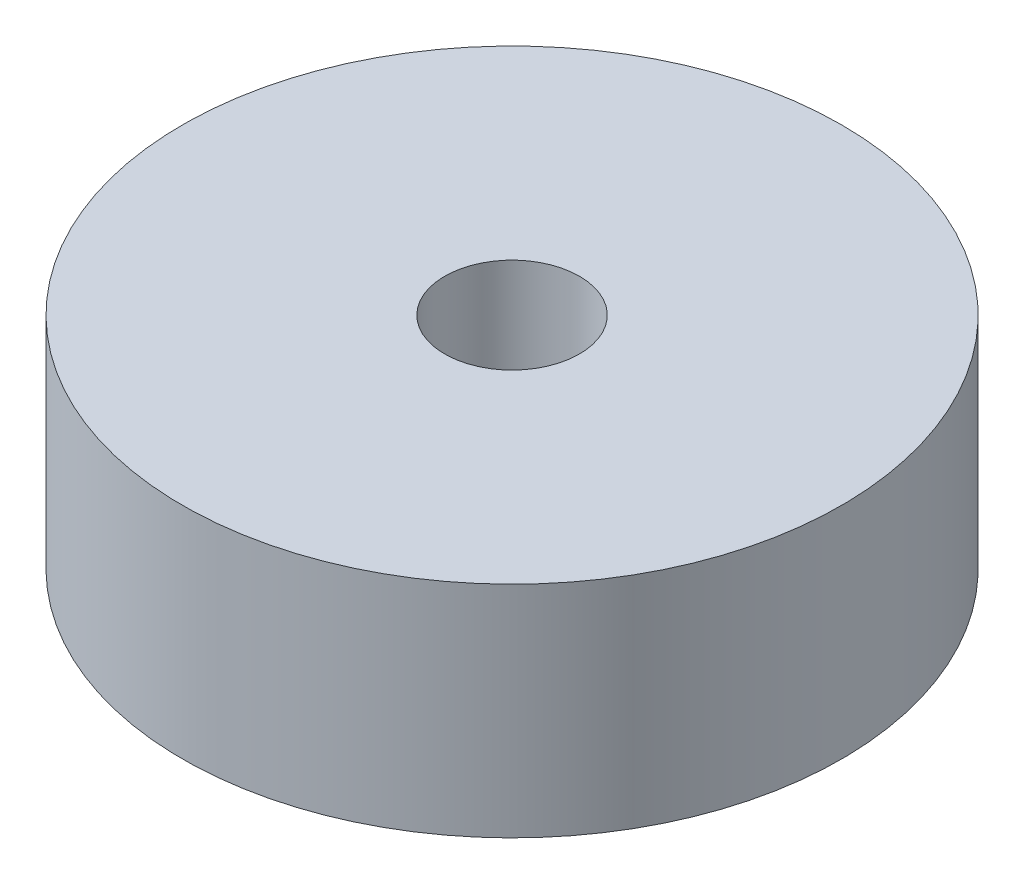
ISO-10303-21;
HEADER;
FILE_DESCRIPTION(('STEP AP214'),'2;1');
FILE_NAME('part.step','',(''),(''),'','','');
FILE_SCHEMA(('AUTOMOTIVE_DESIGN { 1 0 10303 214 1 1 1 1 }'));
ENDSEC;
DATA;
#1=APPLICATION_CONTEXT('core data for automotive mechanical design processes');
#2=APPLICATION_PROTOCOL_DEFINITION('international standard','automotive_design',2000,#1);
#3=PRODUCT_CONTEXT('',#1,'mechanical');
#4=PRODUCT('Part','Part','',(#3));
#5=PRODUCT_RELATED_PRODUCT_CATEGORY('part','',(#4));
#6=PRODUCT_DEFINITION_FORMATION('','',#4);
#7=PRODUCT_DEFINITION_CONTEXT('part definition',#1,'design');
#8=PRODUCT_DEFINITION('design','',#6,#7);
#9=PRODUCT_DEFINITION_SHAPE('','',#8);
#10=(LENGTH_UNIT() NAMED_UNIT(*) SI_UNIT(.MILLI.,.METRE.));
#11=(NAMED_UNIT(*) PLANE_ANGLE_UNIT() SI_UNIT($,.RADIAN.));
#12=(NAMED_UNIT(*) SI_UNIT($,.STERADIAN.) SOLID_ANGLE_UNIT());
#13=UNCERTAINTY_MEASURE_WITH_UNIT(LENGTH_MEASURE(1.E-05),#10,'distance_accuracy_value','');
#14=(GEOMETRIC_REPRESENTATION_CONTEXT(3) GLOBAL_UNCERTAINTY_ASSIGNED_CONTEXT((#13)) GLOBAL_UNIT_ASSIGNED_CONTEXT((#10,
#11,#12)) REPRESENTATION_CONTEXT('',''));
#15=CARTESIAN_POINT('',(0.,0.,0.));
#16=DIRECTION('',(0.,0.,1.));
#17=DIRECTION('',(1.,0.,0.));
#18=AXIS2_PLACEMENT_3D('',#15,#16,#17);
#19=CARTESIAN_POINT('',(0.,19.05,0.));
#20=DIRECTION('',(0.,1.,0.));
#21=DIRECTION('',(0.,0.,1.));
#22=AXIS2_PLACEMENT_3D('',#19,#20,#21);
#23=PLANE('',#22);
#24=CARTESIAN_POINT('',(0.,19.05,0.));
#25=DIRECTION('',(0.,1.,0.));
#26=DIRECTION('',(0.,0.,1.));
#27=AXIS2_PLACEMENT_3D('',#24,#25,#26);
#28=CIRCLE('',#27,28.575);
#29=CARTESIAN_POINT('',(0.,19.05,-28.575));
#30=VERTEX_POINT('',#29);
#31=EDGE_CURVE('E10',#30,#30,#28,.T.);
#32=ORIENTED_EDGE('',*,*,#31,.T.);
#33=EDGE_LOOP('',(#32));
#34=FACE_BOUND('',#33,.T.);
#35=CARTESIAN_POINT('',(0.,19.05,0.));
#36=DIRECTION('',(0.,1.,0.));
#37=DIRECTION('',(0.,0.,1.));
#38=AXIS2_PLACEMENT_3D('',#35,#36,#37);
#39=CIRCLE('',#38,5.842);
#40=CARTESIAN_POINT('',(0.,19.05,-5.842));
#41=VERTEX_POINT('',#40);
#42=EDGE_CURVE('E47',#41,#41,#39,.T.);
#43=ORIENTED_EDGE('',*,*,#42,.F.);
#44=EDGE_LOOP('',(#43));
#45=FACE_BOUND('',#44,.T.);
#46=ADVANCED_FACE('F36',(#34,#45),#23,.T.);
#47=CARTESIAN_POINT('',(0.,0.,0.));
#48=DIRECTION('',(0.,1.,0.));
#49=DIRECTION('',(0.,0.,1.));
#50=AXIS2_PLACEMENT_3D('',#47,#48,#49);
#51=PLANE('',#50);
#52=CARTESIAN_POINT('',(0.,0.,0.));
#53=DIRECTION('',(0.,1.,0.));
#54=DIRECTION('',(0.,0.,1.));
#55=AXIS2_PLACEMENT_3D('',#52,#53,#54);
#56=CIRCLE('',#55,28.575);
#57=CARTESIAN_POINT('',(0.,0.,-28.575));
#58=VERTEX_POINT('',#57);
#59=EDGE_CURVE('E40',#58,#58,#56,.T.);
#60=ORIENTED_EDGE('',*,*,#59,.F.);
#61=EDGE_LOOP('',(#60));
#62=FACE_BOUND('',#61,.T.);
#63=CARTESIAN_POINT('',(0.,0.,0.));
#64=DIRECTION('',(0.,1.,0.));
#65=DIRECTION('',(0.,0.,1.));
#66=AXIS2_PLACEMENT_3D('',#63,#64,#65);
#67=CIRCLE('',#66,5.842);
#68=CARTESIAN_POINT('',(0.,0.,-5.842));
#69=VERTEX_POINT('',#68);
#70=EDGE_CURVE('E49',#69,#69,#67,.T.);
#71=ORIENTED_EDGE('',*,*,#70,.T.);
#72=EDGE_LOOP('',(#71));
#73=FACE_BOUND('',#72,.T.);
#74=ADVANCED_FACE('F59',(#62,#73),#51,.F.);
#75=CARTESIAN_POINT('',(0.,19.05,0.));
#76=DIRECTION('',(0.,-1.,0.));
#77=DIRECTION('',(0.,0.,-1.));
#78=AXIS2_PLACEMENT_3D('',#75,#76,#77);
#79=CYLINDRICAL_SURFACE('',#78,28.575);
#80=CARTESIAN_POINT('',(0.,19.05,-28.575));
#81=CARTESIAN_POINT('',(0.,18.8515625,-28.575));
#82=CARTESIAN_POINT('',(0.,18.653125,-28.575));
#83=CARTESIAN_POINT('',(0.,18.25625,-28.575));
#84=CARTESIAN_POINT('',(0.,18.0578125,-28.575));
#85=CARTESIAN_POINT('',(0.,17.6609375,-28.575));
#86=CARTESIAN_POINT('',(0.,17.4625,-28.575));
#87=CARTESIAN_POINT('',(0.,17.065625,-28.575));
#88=CARTESIAN_POINT('',(0.,16.8671875,-28.575));
#89=CARTESIAN_POINT('',(0.,16.4703125,-28.575));
#90=CARTESIAN_POINT('',(0.,16.271875,-28.575));
#91=CARTESIAN_POINT('',(0.,15.875,-28.575));
#92=CARTESIAN_POINT('',(0.,15.6765625,-28.575));
#93=CARTESIAN_POINT('',(0.,15.2796875,-28.575));
#94=CARTESIAN_POINT('',(0.,15.08125,-28.575));
#95=CARTESIAN_POINT('',(0.,14.684375,-28.575));
#96=CARTESIAN_POINT('',(0.,14.4859375,-28.575));
#97=CARTESIAN_POINT('',(0.,14.0890625,-28.575));
#98=CARTESIAN_POINT('',(0.,13.890625,-28.575));
#99=CARTESIAN_POINT('',(0.,13.49375,-28.575));
#100=CARTESIAN_POINT('',(0.,13.2953125,-28.575));
#101=CARTESIAN_POINT('',(0.,12.8984375,-28.575));
#102=CARTESIAN_POINT('',(0.,12.7,-28.575));
#103=CARTESIAN_POINT('',(0.,12.303125,-28.575));
#104=CARTESIAN_POINT('',(0.,12.1046875,-28.575));
#105=CARTESIAN_POINT('',(0.,11.7078125,-28.575));
#106=CARTESIAN_POINT('',(0.,11.509375,-28.575));
#107=CARTESIAN_POINT('',(0.,11.1125,-28.575));
#108=CARTESIAN_POINT('',(0.,10.9140625,-28.575));
#109=CARTESIAN_POINT('',(0.,10.5171875,-28.575));
#110=CARTESIAN_POINT('',(0.,10.31875,-28.575));
#111=CARTESIAN_POINT('',(0.,9.921875,-28.575));
#112=CARTESIAN_POINT('',(0.,9.7234375,-28.575));
#113=CARTESIAN_POINT('',(0.,9.3265625,-28.575));
#114=CARTESIAN_POINT('',(0.,9.128125,-28.575));
#115=CARTESIAN_POINT('',(0.,8.73125,-28.575));
#116=CARTESIAN_POINT('',(0.,8.5328125,-28.575));
#117=CARTESIAN_POINT('',(0.,8.1359375,-28.575));
#118=CARTESIAN_POINT('',(0.,7.9375,-28.575));
#119=CARTESIAN_POINT('',(0.,7.540625,-28.575));
#120=CARTESIAN_POINT('',(0.,7.3421875,-28.575));
#121=CARTESIAN_POINT('',(0.,6.9453125,-28.575));
#122=CARTESIAN_POINT('',(0.,6.746875,-28.575));
#123=CARTESIAN_POINT('',(0.,6.35,-28.575));
#124=CARTESIAN_POINT('',(0.,6.1515625,-28.575));
#125=CARTESIAN_POINT('',(0.,5.7546875,-28.575));
#126=CARTESIAN_POINT('',(0.,5.55625,-28.575));
#127=CARTESIAN_POINT('',(0.,5.159375,-28.575));
#128=CARTESIAN_POINT('',(0.,4.9609375,-28.575));
#129=CARTESIAN_POINT('',(0.,4.5640625,-28.575));
#130=CARTESIAN_POINT('',(0.,4.365625,-28.575));
#131=CARTESIAN_POINT('',(0.,3.96875,-28.575));
#132=CARTESIAN_POINT('',(0.,3.7703125,-28.575));
#133=CARTESIAN_POINT('',(0.,3.3734375,-28.575));
#134=CARTESIAN_POINT('',(0.,3.175,-28.575));
#135=CARTESIAN_POINT('',(0.,2.778125,-28.575));
#136=CARTESIAN_POINT('',(0.,2.5796875,-28.575));
#137=CARTESIAN_POINT('',(0.,2.1828125,-28.575));
#138=CARTESIAN_POINT('',(0.,1.984375,-28.575));
#139=CARTESIAN_POINT('',(0.,1.5875,-28.575));
#140=CARTESIAN_POINT('',(0.,1.3890625,-28.575));
#141=CARTESIAN_POINT('',(0.,0.992187500000001,-28.575));
#142=CARTESIAN_POINT('',(0.,0.793750000000001,-28.575));
#143=CARTESIAN_POINT('',(0.,0.396875,-28.575));
#144=CARTESIAN_POINT('',(0.,0.1984375,-28.575));
#145=CARTESIAN_POINT('',(0.,0.,-28.575));
#146=B_SPLINE_CURVE_WITH_KNOTS('',3,(#80,#81,#82,#83,#84,#85,#86,#87,#88,#89,#90,#91,#92,#93,
#94,#95,#96,#97,#98,#99,#100,#101,#102,#103,#104,#105,#106,#107,#108,#109,#110,#111,#112,#113,
#114,#115,#116,#117,#118,#119,#120,#121,#122,#123,#124,#125,#126,#127,#128,#129,#130,#131,#132,
#133,#134,#135,#136,#137,#138,#139,#140,#141,#142,#143,#144,#145),.UNSPECIFIED.,.F.,.F.,(4,2,2,
2,2,2,2,2,2,2,2,2,2,2,2,2,2,2,2,2,2,2,2,2,2,2,2,2,2,2,2,2,4),(0.,0.5953125,1.190625,1.7859375,
2.38125,2.9765625,3.571875,4.1671875,4.7625,5.3578125,5.953125,6.5484375,7.14375,7.7390625,
8.334375,8.9296875,9.525,10.1203125,10.715625,11.3109375,11.90625,12.5015625,13.096875,
13.6921875,14.2875,14.8828125,15.478125,16.0734375,16.66875,17.2640625,17.859375,18.4546875,
19.05),.UNSPECIFIED.);
#147=EDGE_CURVE('BSEAM38',#30,#58,#146,.T.);
#148=ORIENTED_EDGE('',*,*,#31,.F.);
#149=ORIENTED_EDGE('',*,*,#59,.T.);
#150=ORIENTED_EDGE('',*,*,#147,.T.);
#151=ORIENTED_EDGE('',*,*,#147,.F.);
#152=EDGE_LOOP('',(#148,#150,#149,#151));
#153=FACE_BOUND('',#152,.T.);
#154=ADVANCED_FACE('F38',(#153),#79,.T.);
#155=CARTESIAN_POINT('',(0.,19.05,0.));
#156=DIRECTION('',(0.,-1.,0.));
#157=DIRECTION('',(0.,0.,-1.));
#158=AXIS2_PLACEMENT_3D('',#155,#156,#157);
#159=CYLINDRICAL_SURFACE('',#158,5.842);
#160=CARTESIAN_POINT('',(0.,19.05,-5.842));
#161=CARTESIAN_POINT('',(0.,18.8515625,-5.842));
#162=CARTESIAN_POINT('',(0.,18.653125,-5.842));
#163=CARTESIAN_POINT('',(0.,18.25625,-5.842));
#164=CARTESIAN_POINT('',(0.,18.0578125,-5.842));
#165=CARTESIAN_POINT('',(0.,17.6609375,-5.842));
#166=CARTESIAN_POINT('',(0.,17.4625,-5.842));
#167=CARTESIAN_POINT('',(0.,17.065625,-5.842));
#168=CARTESIAN_POINT('',(0.,16.8671875,-5.842));
#169=CARTESIAN_POINT('',(0.,16.4703125,-5.842));
#170=CARTESIAN_POINT('',(0.,16.271875,-5.842));
#171=CARTESIAN_POINT('',(0.,15.875,-5.842));
#172=CARTESIAN_POINT('',(0.,15.6765625,-5.842));
#173=CARTESIAN_POINT('',(0.,15.2796875,-5.842));
#174=CARTESIAN_POINT('',(0.,15.08125,-5.842));
#175=CARTESIAN_POINT('',(0.,14.684375,-5.842));
#176=CARTESIAN_POINT('',(0.,14.4859375,-5.842));
#177=CARTESIAN_POINT('',(0.,14.0890625,-5.842));
#178=CARTESIAN_POINT('',(0.,13.890625,-5.842));
#179=CARTESIAN_POINT('',(0.,13.49375,-5.842));
#180=CARTESIAN_POINT('',(0.,13.2953125,-5.842));
#181=CARTESIAN_POINT('',(0.,12.8984375,-5.842));
#182=CARTESIAN_POINT('',(0.,12.7,-5.842));
#183=CARTESIAN_POINT('',(0.,12.303125,-5.842));
#184=CARTESIAN_POINT('',(0.,12.1046875,-5.842));
#185=CARTESIAN_POINT('',(0.,11.7078125,-5.842));
#186=CARTESIAN_POINT('',(0.,11.509375,-5.842));
#187=CARTESIAN_POINT('',(0.,11.1125,-5.842));
#188=CARTESIAN_POINT('',(0.,10.9140625,-5.842));
#189=CARTESIAN_POINT('',(0.,10.5171875,-5.842));
#190=CARTESIAN_POINT('',(0.,10.31875,-5.842));
#191=CARTESIAN_POINT('',(0.,9.921875,-5.842));
#192=CARTESIAN_POINT('',(0.,9.7234375,-5.842));
#193=CARTESIAN_POINT('',(0.,9.3265625,-5.842));
#194=CARTESIAN_POINT('',(0.,9.128125,-5.842));
#195=CARTESIAN_POINT('',(0.,8.73125,-5.842));
#196=CARTESIAN_POINT('',(0.,8.5328125,-5.842));
#197=CARTESIAN_POINT('',(0.,8.1359375,-5.842));
#198=CARTESIAN_POINT('',(0.,7.9375,-5.842));
#199=CARTESIAN_POINT('',(0.,7.540625,-5.842));
#200=CARTESIAN_POINT('',(0.,7.3421875,-5.842));
#201=CARTESIAN_POINT('',(0.,6.9453125,-5.842));
#202=CARTESIAN_POINT('',(0.,6.746875,-5.842));
#203=CARTESIAN_POINT('',(0.,6.35,-5.842));
#204=CARTESIAN_POINT('',(0.,6.1515625,-5.842));
#205=CARTESIAN_POINT('',(0.,5.7546875,-5.842));
#206=CARTESIAN_POINT('',(0.,5.55625,-5.842));
#207=CARTESIAN_POINT('',(0.,5.159375,-5.842));
#208=CARTESIAN_POINT('',(0.,4.9609375,-5.842));
#209=CARTESIAN_POINT('',(0.,4.5640625,-5.842));
#210=CARTESIAN_POINT('',(0.,4.365625,-5.842));
#211=CARTESIAN_POINT('',(0.,3.96875,-5.842));
#212=CARTESIAN_POINT('',(0.,3.7703125,-5.842));
#213=CARTESIAN_POINT('',(0.,3.3734375,-5.842));
#214=CARTESIAN_POINT('',(0.,3.175,-5.842));
#215=CARTESIAN_POINT('',(0.,2.778125,-5.842));
#216=CARTESIAN_POINT('',(0.,2.5796875,-5.842));
#217=CARTESIAN_POINT('',(0.,2.1828125,-5.842));
#218=CARTESIAN_POINT('',(0.,1.984375,-5.842));
#219=CARTESIAN_POINT('',(0.,1.5875,-5.842));
#220=CARTESIAN_POINT('',(0.,1.3890625,-5.842));
#221=CARTESIAN_POINT('',(0.,0.992187500000001,-5.842));
#222=CARTESIAN_POINT('',(0.,0.793750000000001,-5.842));
#223=CARTESIAN_POINT('',(0.,0.396875,-5.842));
#224=CARTESIAN_POINT('',(0.,0.1984375,-5.842));
#225=CARTESIAN_POINT('',(0.,0.,-5.842));
#226=B_SPLINE_CURVE_WITH_KNOTS('',3,(#160,#161,#162,#163,#164,#165,#166,#167,#168,#169,#170,
#171,#172,#173,#174,#175,#176,#177,#178,#179,#180,#181,#182,#183,#184,#185,#186,#187,#188,#189,
#190,#191,#192,#193,#194,#195,#196,#197,#198,#199,#200,#201,#202,#203,#204,#205,#206,#207,#208,
#209,#210,#211,#212,#213,#214,#215,#216,#217,#218,#219,#220,#221,#222,#223,#224,#225),
.UNSPECIFIED.,.F.,.F.,(4,2,2,2,2,2,2,2,2,2,2,2,2,2,2,2,2,2,2,2,2,2,2,2,2,2,2,2,2,2,2,2,4),(0.,
0.595312499999997,1.190625,1.7859375,2.38125,2.9765625,3.571875,4.1671875,4.7625,5.3578125,
5.953125,6.5484375,7.14375,7.7390625,8.334375,8.9296875,9.525,10.1203125,10.715625,11.3109375,
11.90625,12.5015625,13.096875,13.6921875,14.2875,14.8828125,15.478125,16.0734375,16.66875,
17.2640625,17.859375,18.4546875,19.05),.UNSPECIFIED.);
#227=EDGE_CURVE('BSEAM55',#41,#69,#226,.T.);
#228=ORIENTED_EDGE('',*,*,#42,.T.);
#229=ORIENTED_EDGE('',*,*,#70,.F.);
#230=ORIENTED_EDGE('',*,*,#227,.T.);
#231=ORIENTED_EDGE('',*,*,#227,.F.);
#232=EDGE_LOOP('',(#228,#230,#229,#231));
#233=FACE_BOUND('',#232,.T.);
#234=ADVANCED_FACE('F55',(#233),#159,.F.);
#235=CLOSED_SHELL('',(#46,#74,#154,#234));
#236=MANIFOLD_SOLID_BREP('B2',#235);
#237=ADVANCED_BREP_SHAPE_REPRESENTATION('',(#18,#236),#14);
#238=SHAPE_DEFINITION_REPRESENTATION(#9,#237);
ENDSEC;
END-ISO-10303-21;
